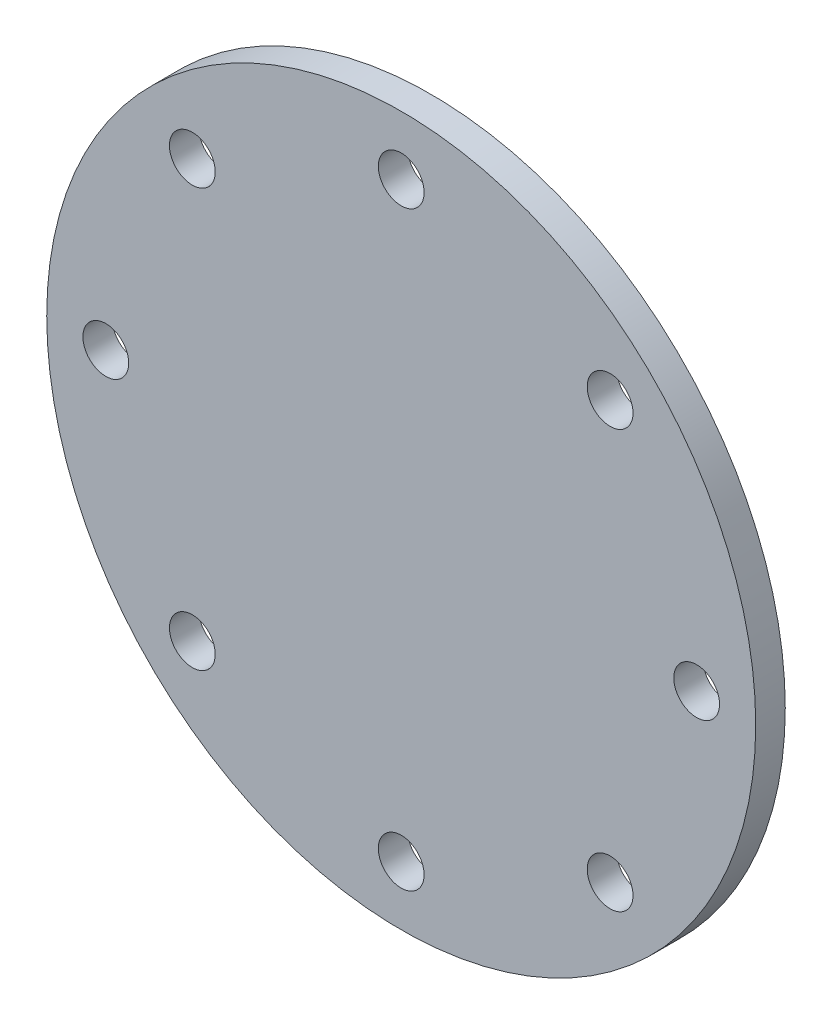
ISO-10303-21;
HEADER;
FILE_DESCRIPTION(('STEP AP214'),'2;1');
FILE_NAME('part.step','',(''),(''),'','','');
FILE_SCHEMA(('AUTOMOTIVE_DESIGN { 1 0 10303 214 1 1 1 1 }'));
ENDSEC;
DATA;
#1=APPLICATION_CONTEXT('core data for automotive mechanical design processes');
#2=APPLICATION_PROTOCOL_DEFINITION('international standard','automotive_design',2000,#1);
#3=PRODUCT_CONTEXT('',#1,'mechanical');
#4=PRODUCT('Part','Part','',(#3));
#5=PRODUCT_RELATED_PRODUCT_CATEGORY('part','',(#4));
#6=PRODUCT_DEFINITION_FORMATION('','',#4);
#7=PRODUCT_DEFINITION_CONTEXT('part definition',#1,'design');
#8=PRODUCT_DEFINITION('design','',#6,#7);
#9=PRODUCT_DEFINITION_SHAPE('','',#8);
#10=(LENGTH_UNIT() NAMED_UNIT(*) SI_UNIT(.MILLI.,.METRE.));
#11=(NAMED_UNIT(*) PLANE_ANGLE_UNIT() SI_UNIT($,.RADIAN.));
#12=(NAMED_UNIT(*) SI_UNIT($,.STERADIAN.) SOLID_ANGLE_UNIT());
#13=UNCERTAINTY_MEASURE_WITH_UNIT(LENGTH_MEASURE(1.E-05),#10,'distance_accuracy_value','');
#14=(GEOMETRIC_REPRESENTATION_CONTEXT(3) GLOBAL_UNCERTAINTY_ASSIGNED_CONTEXT((#13)) GLOBAL_UNIT_ASSIGNED_CONTEXT((#10,
#11,#12)) REPRESENTATION_CONTEXT('',''));
#15=CARTESIAN_POINT('',(0.,0.,0.));
#16=DIRECTION('',(0.,0.,1.));
#17=DIRECTION('',(1.,0.,0.));
#18=AXIS2_PLACEMENT_3D('',#15,#16,#17);
#19=CARTESIAN_POINT('',(0.,0.,2.));
#20=DIRECTION('',(0.,0.,1.));
#21=DIRECTION('',(1.,0.,0.));
#22=AXIS2_PLACEMENT_3D('',#19,#20,#21);
#23=PLANE('',#22);
#24=CARTESIAN_POINT('',(-19.9999999999992,-8.5265128291212E-13,2.));
#25=DIRECTION('',(0.,0.,1.));
#26=DIRECTION('',(1.,0.,0.));
#27=AXIS2_PLACEMENT_3D('',#24,#25,#26);
#28=CIRCLE('',#27,1.55000000000126);
#29=CARTESIAN_POINT('',(-18.4499999999979,-8.5265128291212E-13,2.));
#30=VERTEX_POINT('',#29);
#31=EDGE_CURVE('E78',#30,#30,#28,.T.);
#32=ORIENTED_EDGE('',*,*,#31,.F.);
#33=EDGE_LOOP('',(#32));
#34=FACE_BOUND('',#33,.T.);
#35=CARTESIAN_POINT('',(1.70040397862765E-12,-20.,2.));
#36=DIRECTION('',(0.,0.,1.));
#37=DIRECTION('',(1.,0.,0.));
#38=AXIS2_PLACEMENT_3D('',#35,#36,#37);
#39=CIRCLE('',#38,1.55000000000176);
#40=CARTESIAN_POINT('',(1.55000000000346,-20.,2.));
#41=VERTEX_POINT('',#40);
#42=EDGE_CURVE('E66',#41,#41,#39,.T.);
#43=ORIENTED_EDGE('',*,*,#42,.F.);
#44=EDGE_LOOP('',(#43));
#45=FACE_BOUND('',#44,.T.);
#46=CARTESIAN_POINT('',(20.0000000000008,8.50201989313825E-13,2.));
#47=DIRECTION('',(0.,0.,1.));
#48=DIRECTION('',(1.,0.,0.));
#49=AXIS2_PLACEMENT_3D('',#46,#47,#48);
#50=CIRCLE('',#49,1.55000000000063);
#51=CARTESIAN_POINT('',(21.5500000000015,8.50201989313825E-13,2.));
#52=VERTEX_POINT('',#51);
#53=EDGE_CURVE('E54',#52,#52,#50,.T.);
#54=ORIENTED_EDGE('',*,*,#53,.F.);
#55=EDGE_LOOP('',(#54));
#56=FACE_BOUND('',#55,.T.);
#57=CARTESIAN_POINT('',(0.,20.,2.));
#58=DIRECTION('',(0.,0.,1.));
#59=DIRECTION('',(1.,0.,0.));
#60=AXIS2_PLACEMENT_3D('',#57,#58,#59);
#61=CIRCLE('',#60,1.55);
#62=CARTESIAN_POINT('',(1.55,20.,2.));
#63=VERTEX_POINT('',#62);
#64=EDGE_CURVE('E43',#63,#63,#61,.T.);
#65=ORIENTED_EDGE('',*,*,#64,.F.);
#66=EDGE_LOOP('',(#65));
#67=FACE_BOUND('',#66,.T.);
#68=CARTESIAN_POINT('',(0.,0.,2.));
#69=DIRECTION('',(0.,0.,1.));
#70=DIRECTION('',(1.,0.,0.));
#71=AXIS2_PLACEMENT_3D('',#68,#69,#70);
#72=CIRCLE('',#71,24.);
#73=CARTESIAN_POINT('',(24.,0.,2.));
#74=VERTEX_POINT('',#73);
#75=EDGE_CURVE('E10',#74,#74,#72,.T.);
#76=ORIENTED_EDGE('',*,*,#75,.T.);
#77=EDGE_LOOP('',(#76));
#78=FACE_BOUND('',#77,.T.);
#79=CARTESIAN_POINT('',(14.1421356237312,14.1421356237316,2.));
#80=DIRECTION('',(0.,0.,1.));
#81=DIRECTION('',(1.,0.,0.));
#82=AXIS2_PLACEMENT_3D('',#79,#80,#81);
#83=CIRCLE('',#82,1.5500000000001);
#84=CARTESIAN_POINT('',(15.6921356237313,14.1421356237316,2.));
#85=VERTEX_POINT('',#84);
#86=EDGE_CURVE('E48',#85,#85,#83,.T.);
#87=ORIENTED_EDGE('',*,*,#86,.F.);
#88=EDGE_LOOP('',(#87));
#89=FACE_BOUND('',#88,.T.);
#90=CARTESIAN_POINT('',(14.1421356237324,-14.1421356237303,2.));
#91=DIRECTION('',(0.,0.,1.));
#92=DIRECTION('',(1.,0.,0.));
#93=AXIS2_PLACEMENT_3D('',#90,#91,#92);
#94=CIRCLE('',#93,1.55000000000131);
#95=CARTESIAN_POINT('',(15.6921356237337,-14.1421356237303,2.));
#96=VERTEX_POINT('',#95);
#97=EDGE_CURVE('E60',#96,#96,#94,.T.);
#98=ORIENTED_EDGE('',*,*,#97,.F.);
#99=EDGE_LOOP('',(#98));
#100=FACE_BOUND('',#99,.T.);
#101=CARTESIAN_POINT('',(-14.1421356237295,-14.1421356237316,2.));
#102=DIRECTION('',(0.,0.,1.));
#103=DIRECTION('',(1.,0.,0.));
#104=AXIS2_PLACEMENT_3D('',#101,#102,#103);
#105=CIRCLE('',#104,1.55000000000173);
#106=CARTESIAN_POINT('',(-12.5921356237278,-14.1421356237316,2.));
#107=VERTEX_POINT('',#106);
#108=EDGE_CURVE('E72',#107,#107,#105,.T.);
#109=ORIENTED_EDGE('',*,*,#108,.F.);
#110=EDGE_LOOP('',(#109));
#111=FACE_BOUND('',#110,.T.);
#112=CARTESIAN_POINT('',(-14.1421356237307,14.1421356237303,2.));
#113=DIRECTION('',(0.,0.,1.));
#114=DIRECTION('',(1.,0.,0.));
#115=AXIS2_PLACEMENT_3D('',#112,#113,#114);
#116=CIRCLE('',#115,1.55000000000065);
#117=CARTESIAN_POINT('',(-12.5921356237301,14.1421356237303,2.));
#118=VERTEX_POINT('',#117);
#119=EDGE_CURVE('E84',#118,#118,#116,.T.);
#120=ORIENTED_EDGE('',*,*,#119,.F.);
#121=EDGE_LOOP('',(#120));
#122=FACE_BOUND('',#121,.T.);
#123=ADVANCED_FACE('F32',(#34,#45,#56,#67,#78,#89,#100,#111,#122),#23,.T.);
#124=CARTESIAN_POINT('',(0.,0.,0.));
#125=DIRECTION('',(0.,0.,1.));
#126=DIRECTION('',(1.,0.,0.));
#127=AXIS2_PLACEMENT_3D('',#124,#125,#126);
#128=PLANE('',#127);
#129=CARTESIAN_POINT('',(0.,0.,0.));
#130=DIRECTION('',(0.,0.,1.));
#131=DIRECTION('',(1.,0.,0.));
#132=AXIS2_PLACEMENT_3D('',#129,#130,#131);
#133=CIRCLE('',#132,24.);
#134=CARTESIAN_POINT('',(24.,0.,0.));
#135=VERTEX_POINT('',#134);
#136=EDGE_CURVE('E36',#135,#135,#133,.T.);
#137=ORIENTED_EDGE('',*,*,#136,.F.);
#138=EDGE_LOOP('',(#137));
#139=FACE_BOUND('',#138,.T.);
#140=CARTESIAN_POINT('',(0.,20.,0.));
#141=DIRECTION('',(0.,0.,1.));
#142=DIRECTION('',(1.,0.,0.));
#143=AXIS2_PLACEMENT_3D('',#140,#141,#142);
#144=CIRCLE('',#143,1.55);
#145=CARTESIAN_POINT('',(1.55,20.,0.));
#146=VERTEX_POINT('',#145);
#147=EDGE_CURVE('E45',#146,#146,#144,.T.);
#148=ORIENTED_EDGE('',*,*,#147,.T.);
#149=EDGE_LOOP('',(#148));
#150=FACE_BOUND('',#149,.T.);
#151=CARTESIAN_POINT('',(14.1421356237312,14.1421356237316,0.));
#152=DIRECTION('',(0.,0.,1.));
#153=DIRECTION('',(1.,0.,0.));
#154=AXIS2_PLACEMENT_3D('',#151,#152,#153);
#155=CIRCLE('',#154,1.5500000000001);
#156=CARTESIAN_POINT('',(15.6921356237313,14.1421356237316,0.));
#157=VERTEX_POINT('',#156);
#158=EDGE_CURVE('E51',#157,#157,#155,.T.);
#159=ORIENTED_EDGE('',*,*,#158,.T.);
#160=EDGE_LOOP('',(#159));
#161=FACE_BOUND('',#160,.T.);
#162=CARTESIAN_POINT('',(20.0000000000008,8.50201989313825E-13,0.));
#163=DIRECTION('',(0.,0.,1.));
#164=DIRECTION('',(1.,0.,0.));
#165=AXIS2_PLACEMENT_3D('',#162,#163,#164);
#166=CIRCLE('',#165,1.55000000000063);
#167=CARTESIAN_POINT('',(21.5500000000015,8.50201989313825E-13,0.));
#168=VERTEX_POINT('',#167);
#169=EDGE_CURVE('E57',#168,#168,#166,.T.);
#170=ORIENTED_EDGE('',*,*,#169,.T.);
#171=EDGE_LOOP('',(#170));
#172=FACE_BOUND('',#171,.T.);
#173=CARTESIAN_POINT('',(14.1421356237324,-14.1421356237303,0.));
#174=DIRECTION('',(0.,0.,1.));
#175=DIRECTION('',(1.,0.,0.));
#176=AXIS2_PLACEMENT_3D('',#173,#174,#175);
#177=CIRCLE('',#176,1.55000000000131);
#178=CARTESIAN_POINT('',(15.6921356237337,-14.1421356237303,0.));
#179=VERTEX_POINT('',#178);
#180=EDGE_CURVE('E63',#179,#179,#177,.T.);
#181=ORIENTED_EDGE('',*,*,#180,.T.);
#182=EDGE_LOOP('',(#181));
#183=FACE_BOUND('',#182,.T.);
#184=CARTESIAN_POINT('',(1.70040397862765E-12,-20.,0.));
#185=DIRECTION('',(0.,0.,1.));
#186=DIRECTION('',(1.,0.,0.));
#187=AXIS2_PLACEMENT_3D('',#184,#185,#186);
#188=CIRCLE('',#187,1.55000000000176);
#189=CARTESIAN_POINT('',(1.55000000000346,-20.,0.));
#190=VERTEX_POINT('',#189);
#191=EDGE_CURVE('E69',#190,#190,#188,.T.);
#192=ORIENTED_EDGE('',*,*,#191,.T.);
#193=EDGE_LOOP('',(#192));
#194=FACE_BOUND('',#193,.T.);
#195=CARTESIAN_POINT('',(-14.1421356237295,-14.1421356237316,0.));
#196=DIRECTION('',(0.,0.,1.));
#197=DIRECTION('',(1.,0.,0.));
#198=AXIS2_PLACEMENT_3D('',#195,#196,#197);
#199=CIRCLE('',#198,1.55000000000173);
#200=CARTESIAN_POINT('',(-12.5921356237278,-14.1421356237316,0.));
#201=VERTEX_POINT('',#200);
#202=EDGE_CURVE('E75',#201,#201,#199,.T.);
#203=ORIENTED_EDGE('',*,*,#202,.T.);
#204=EDGE_LOOP('',(#203));
#205=FACE_BOUND('',#204,.T.);
#206=CARTESIAN_POINT('',(-19.9999999999992,-8.5265128291212E-13,0.));
#207=DIRECTION('',(0.,0.,1.));
#208=DIRECTION('',(1.,0.,0.));
#209=AXIS2_PLACEMENT_3D('',#206,#207,#208);
#210=CIRCLE('',#209,1.55000000000126);
#211=CARTESIAN_POINT('',(-18.4499999999979,-8.5265128291212E-13,0.));
#212=VERTEX_POINT('',#211);
#213=EDGE_CURVE('E81',#212,#212,#210,.T.);
#214=ORIENTED_EDGE('',*,*,#213,.T.);
#215=EDGE_LOOP('',(#214));
#216=FACE_BOUND('',#215,.T.);
#217=CARTESIAN_POINT('',(-14.1421356237307,14.1421356237303,0.));
#218=DIRECTION('',(0.,0.,1.));
#219=DIRECTION('',(1.,0.,0.));
#220=AXIS2_PLACEMENT_3D('',#217,#218,#219);
#221=CIRCLE('',#220,1.55000000000065);
#222=CARTESIAN_POINT('',(-12.5921356237301,14.1421356237303,0.));
#223=VERTEX_POINT('',#222);
#224=EDGE_CURVE('E87',#223,#223,#221,.T.);
#225=ORIENTED_EDGE('',*,*,#224,.T.);
#226=EDGE_LOOP('',(#225));
#227=FACE_BOUND('',#226,.T.);
#228=ADVANCED_FACE('F97',(#139,#150,#161,#172,#183,#194,#205,#216,#227),#128,.F.);
#229=CARTESIAN_POINT('',(0.,0.,2.));
#230=DIRECTION('',(0.,0.,-1.));
#231=DIRECTION('',(-1.,0.,0.));
#232=AXIS2_PLACEMENT_3D('',#229,#230,#231);
#233=CYLINDRICAL_SURFACE('',#232,24.);
#234=ORIENTED_EDGE('',*,*,#75,.F.);
#235=EDGE_LOOP('',(#234));
#236=FACE_BOUND('',#235,.T.);
#237=ORIENTED_EDGE('',*,*,#136,.T.);
#238=EDGE_LOOP('',(#237));
#239=FACE_BOUND('',#238,.T.);
#240=ADVANCED_FACE('F34',(#236,#239),#233,.T.);
#241=CARTESIAN_POINT('',(0.,20.,2.));
#242=DIRECTION('',(0.,0.,-1.));
#243=DIRECTION('',(-1.,0.,0.));
#244=AXIS2_PLACEMENT_3D('',#241,#242,#243);
#245=CYLINDRICAL_SURFACE('',#244,1.55);
#246=ORIENTED_EDGE('',*,*,#64,.T.);
#247=EDGE_LOOP('',(#246));
#248=FACE_BOUND('',#247,.T.);
#249=ORIENTED_EDGE('',*,*,#147,.F.);
#250=EDGE_LOOP('',(#249));
#251=FACE_BOUND('',#250,.T.);
#252=ADVANCED_FACE('F107',(#248,#251),#245,.F.);
#253=CARTESIAN_POINT('',(14.1421356237312,14.1421356237316,2.));
#254=DIRECTION('',(0.,0.,-1.));
#255=DIRECTION('',(-1.,0.,0.));
#256=AXIS2_PLACEMENT_3D('',#253,#254,#255);
#257=CYLINDRICAL_SURFACE('',#256,1.5500000000001);
#258=ORIENTED_EDGE('',*,*,#86,.T.);
#259=EDGE_LOOP('',(#258));
#260=FACE_BOUND('',#259,.T.);
#261=ORIENTED_EDGE('',*,*,#158,.F.);
#262=EDGE_LOOP('',(#261));
#263=FACE_BOUND('',#262,.T.);
#264=ADVANCED_FACE('F110',(#260,#263),#257,.F.);
#265=CARTESIAN_POINT('',(20.0000000000008,8.50201989313825E-13,2.));
#266=DIRECTION('',(0.,0.,-1.));
#267=DIRECTION('',(-1.,0.,0.));
#268=AXIS2_PLACEMENT_3D('',#265,#266,#267);
#269=CYLINDRICAL_SURFACE('',#268,1.55000000000063);
#270=ORIENTED_EDGE('',*,*,#53,.T.);
#271=EDGE_LOOP('',(#270));
#272=FACE_BOUND('',#271,.T.);
#273=ORIENTED_EDGE('',*,*,#169,.F.);
#274=EDGE_LOOP('',(#273));
#275=FACE_BOUND('',#274,.T.);
#276=ADVANCED_FACE('F114',(#272,#275),#269,.F.);
#277=CARTESIAN_POINT('',(14.1421356237324,-14.1421356237303,2.));
#278=DIRECTION('',(0.,0.,-1.));
#279=DIRECTION('',(-1.,0.,0.));
#280=AXIS2_PLACEMENT_3D('',#277,#278,#279);
#281=CYLINDRICAL_SURFACE('',#280,1.55000000000131);
#282=ORIENTED_EDGE('',*,*,#97,.T.);
#283=EDGE_LOOP('',(#282));
#284=FACE_BOUND('',#283,.T.);
#285=ORIENTED_EDGE('',*,*,#180,.F.);
#286=EDGE_LOOP('',(#285));
#287=FACE_BOUND('',#286,.T.);
#288=ADVANCED_FACE('F118',(#284,#287),#281,.F.);
#289=CARTESIAN_POINT('',(1.70040397862765E-12,-20.,2.));
#290=DIRECTION('',(0.,0.,-1.));
#291=DIRECTION('',(-1.,0.,0.));
#292=AXIS2_PLACEMENT_3D('',#289,#290,#291);
#293=CYLINDRICAL_SURFACE('',#292,1.55000000000176);
#294=ORIENTED_EDGE('',*,*,#42,.T.);
#295=EDGE_LOOP('',(#294));
#296=FACE_BOUND('',#295,.T.);
#297=ORIENTED_EDGE('',*,*,#191,.F.);
#298=EDGE_LOOP('',(#297));
#299=FACE_BOUND('',#298,.T.);
#300=ADVANCED_FACE('F122',(#296,#299),#293,.F.);
#301=CARTESIAN_POINT('',(-14.1421356237295,-14.1421356237316,2.));
#302=DIRECTION('',(0.,0.,-1.));
#303=DIRECTION('',(-1.,0.,0.));
#304=AXIS2_PLACEMENT_3D('',#301,#302,#303);
#305=CYLINDRICAL_SURFACE('',#304,1.55000000000173);
#306=ORIENTED_EDGE('',*,*,#108,.T.);
#307=EDGE_LOOP('',(#306));
#308=FACE_BOUND('',#307,.T.);
#309=ORIENTED_EDGE('',*,*,#202,.F.);
#310=EDGE_LOOP('',(#309));
#311=FACE_BOUND('',#310,.T.);
#312=ADVANCED_FACE('F126',(#308,#311),#305,.F.);
#313=CARTESIAN_POINT('',(-19.9999999999992,-8.5265128291212E-13,2.));
#314=DIRECTION('',(0.,0.,-1.));
#315=DIRECTION('',(-1.,0.,0.));
#316=AXIS2_PLACEMENT_3D('',#313,#314,#315);
#317=CYLINDRICAL_SURFACE('',#316,1.55000000000126);
#318=ORIENTED_EDGE('',*,*,#31,.T.);
#319=EDGE_LOOP('',(#318));
#320=FACE_BOUND('',#319,.T.);
#321=ORIENTED_EDGE('',*,*,#213,.F.);
#322=EDGE_LOOP('',(#321));
#323=FACE_BOUND('',#322,.T.);
#324=ADVANCED_FACE('F130',(#320,#323),#317,.F.);
#325=CARTESIAN_POINT('',(-14.1421356237307,14.1421356237303,2.));
#326=DIRECTION('',(0.,0.,-1.));
#327=DIRECTION('',(-1.,0.,0.));
#328=AXIS2_PLACEMENT_3D('',#325,#326,#327);
#329=CYLINDRICAL_SURFACE('',#328,1.55000000000065);
#330=ORIENTED_EDGE('',*,*,#119,.T.);
#331=EDGE_LOOP('',(#330));
#332=FACE_BOUND('',#331,.T.);
#333=ORIENTED_EDGE('',*,*,#224,.F.);
#334=EDGE_LOOP('',(#333));
#335=FACE_BOUND('',#334,.T.);
#336=ADVANCED_FACE('F93',(#332,#335),#329,.F.);
#337=CLOSED_SHELL('',(#123,#228,#240,#252,#264,#276,#288,#300,#312,#324,#336));
#338=MANIFOLD_SOLID_BREP('B2',#337);
#339=ADVANCED_BREP_SHAPE_REPRESENTATION('',(#18,#338),#14);
#340=SHAPE_DEFINITION_REPRESENTATION(#9,#339);
ENDSEC;
END-ISO-10303-21;
